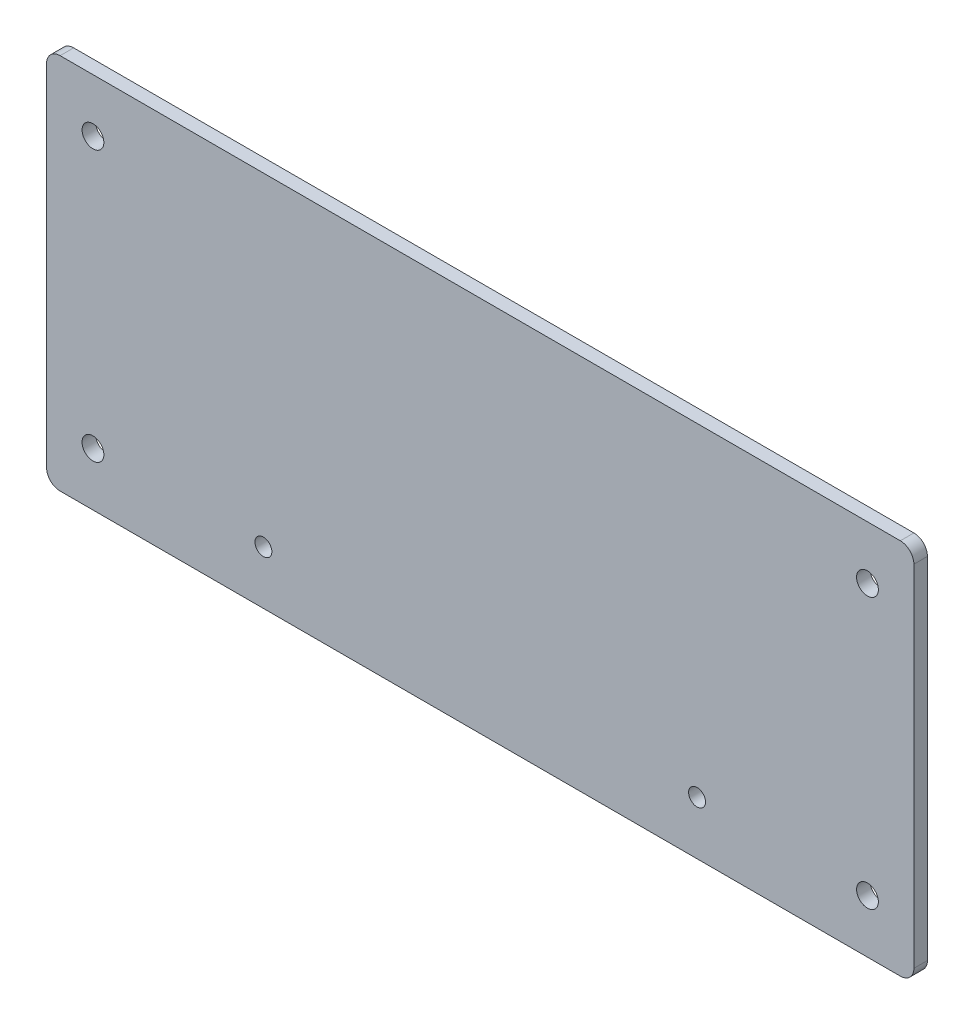
ISO-10303-21;
HEADER;
FILE_DESCRIPTION(('STEP AP214'),'2;1');
FILE_NAME('part.step','',(''),(''),'','','');
FILE_SCHEMA(('AUTOMOTIVE_DESIGN { 1 0 10303 214 1 1 1 1 }'));
ENDSEC;
DATA;
#1=APPLICATION_CONTEXT('core data for automotive mechanical design processes');
#2=APPLICATION_PROTOCOL_DEFINITION('international standard','automotive_design',2000,#1);
#3=PRODUCT_CONTEXT('',#1,'mechanical');
#4=PRODUCT('Part','Part','',(#3));
#5=PRODUCT_RELATED_PRODUCT_CATEGORY('part','',(#4));
#6=PRODUCT_DEFINITION_FORMATION('','',#4);
#7=PRODUCT_DEFINITION_CONTEXT('part definition',#1,'design');
#8=PRODUCT_DEFINITION('design','',#6,#7);
#9=PRODUCT_DEFINITION_SHAPE('','',#8);
#10=(LENGTH_UNIT() NAMED_UNIT(*) SI_UNIT(.MILLI.,.METRE.));
#11=(NAMED_UNIT(*) PLANE_ANGLE_UNIT() SI_UNIT($,.RADIAN.));
#12=(NAMED_UNIT(*) SI_UNIT($,.STERADIAN.) SOLID_ANGLE_UNIT());
#13=UNCERTAINTY_MEASURE_WITH_UNIT(LENGTH_MEASURE(1.E-05),#10,'distance_accuracy_value','');
#14=(GEOMETRIC_REPRESENTATION_CONTEXT(3) GLOBAL_UNCERTAINTY_ASSIGNED_CONTEXT((#13)) GLOBAL_UNIT_ASSIGNED_CONTEXT((#10,
#11,#12)) REPRESENTATION_CONTEXT('',''));
#15=CARTESIAN_POINT('',(0.,0.,0.));
#16=DIRECTION('',(0.,0.,1.));
#17=DIRECTION('',(1.,0.,0.));
#18=AXIS2_PLACEMENT_3D('',#15,#16,#17);
#19=CARTESIAN_POINT('',(-101.6,-44.1706,-3.175));
#20=DIRECTION('',(0.,0.,1.));
#21=DIRECTION('',(1.,0.,0.));
#22=AXIS2_PLACEMENT_3D('',#19,#20,#21);
#23=PLANE('',#22);
#24=CARTESIAN_POINT('',(-90.7288,-31.6738,-3.17500000000001));
#25=DIRECTION('',(0.,0.,-1.));
#26=DIRECTION('',(-1.,0.,0.));
#27=AXIS2_PLACEMENT_3D('',#24,#25,#26);
#28=CIRCLE('',#27,2.5527);
#29=CARTESIAN_POINT('',(-93.2815,-31.6738,-3.17500000000001));
#30=VERTEX_POINT('',#29);
#31=EDGE_CURVE('E145',#30,#30,#28,.F.);
#32=ORIENTED_EDGE('',*,*,#31,.T.);
#33=EDGE_LOOP('',(#32));
#34=FACE_BOUND('',#33,.T.);
#35=CARTESIAN_POINT('',(90.7288,-31.6738,-3.17500000000001));
#36=DIRECTION('',(0.,0.,-1.));
#37=DIRECTION('',(-1.,0.,0.));
#38=AXIS2_PLACEMENT_3D('',#35,#36,#37);
#39=CIRCLE('',#38,2.5527);
#40=CARTESIAN_POINT('',(88.1761,-31.6738,-3.17500000000001));
#41=VERTEX_POINT('',#40);
#42=EDGE_CURVE('E148',#41,#41,#39,.F.);
#43=ORIENTED_EDGE('',*,*,#42,.T.);
#44=EDGE_LOOP('',(#43));
#45=FACE_BOUND('',#44,.T.);
#46=CARTESIAN_POINT('',(90.7288,31.6738,-3.17500000000001));
#47=DIRECTION('',(0.,0.,-1.));
#48=DIRECTION('',(-1.,0.,0.));
#49=AXIS2_PLACEMENT_3D('',#46,#47,#48);
#50=CIRCLE('',#49,2.5527);
#51=CARTESIAN_POINT('',(88.1761,31.6738,-3.17500000000001));
#52=VERTEX_POINT('',#51);
#53=EDGE_CURVE('E151',#52,#52,#50,.F.);
#54=ORIENTED_EDGE('',*,*,#53,.T.);
#55=EDGE_LOOP('',(#54));
#56=FACE_BOUND('',#55,.T.);
#57=CARTESIAN_POINT('',(-90.7288,31.6738,-3.17500000000001));
#58=DIRECTION('',(0.,0.,-1.));
#59=DIRECTION('',(-1.,0.,0.));
#60=AXIS2_PLACEMENT_3D('',#57,#58,#59);
#61=CIRCLE('',#60,2.5527);
#62=CARTESIAN_POINT('',(-93.2815,31.6738,-3.17500000000001));
#63=VERTEX_POINT('',#62);
#64=EDGE_CURVE('E154',#63,#63,#61,.F.);
#65=ORIENTED_EDGE('',*,*,#64,.T.);
#66=EDGE_LOOP('',(#65));
#67=FACE_BOUND('',#66,.T.);
#68=CARTESIAN_POINT('',(-50.8,-31.6738,-3.17500000000001));
#69=DIRECTION('',(0.,0.,-1.));
#70=DIRECTION('',(-1.,0.,0.));
#71=AXIS2_PLACEMENT_3D('',#68,#69,#70);
#72=CIRCLE('',#71,1.9812);
#73=CARTESIAN_POINT('',(-52.7812,-31.6738,-3.17500000000001));
#74=VERTEX_POINT('',#73);
#75=EDGE_CURVE('E157',#74,#74,#72,.F.);
#76=ORIENTED_EDGE('',*,*,#75,.T.);
#77=EDGE_LOOP('',(#76));
#78=FACE_BOUND('',#77,.T.);
#79=CARTESIAN_POINT('',(50.8,-31.6738,-3.17500000000001));
#80=DIRECTION('',(0.,0.,-1.));
#81=DIRECTION('',(-1.,0.,0.));
#82=AXIS2_PLACEMENT_3D('',#79,#80,#81);
#83=CIRCLE('',#82,1.9812);
#84=CARTESIAN_POINT('',(48.8188,-31.6738,-3.17500000000001));
#85=VERTEX_POINT('',#84);
#86=EDGE_CURVE('E160',#85,#85,#83,.F.);
#87=ORIENTED_EDGE('',*,*,#86,.T.);
#88=EDGE_LOOP('',(#87));
#89=FACE_BOUND('',#88,.T.);
#90=CARTESIAN_POINT('',(98.425,-40.9956,-3.175));
#91=DIRECTION('',(0.,0.,-1.));
#92=DIRECTION('',(-1.,0.,0.));
#93=AXIS2_PLACEMENT_3D('',#90,#91,#92);
#94=CIRCLE('',#93,3.175);
#95=CARTESIAN_POINT('',(98.425,-44.1706,-3.175));
#96=VERTEX_POINT('',#95);
#97=CARTESIAN_POINT('',(101.6,-40.9956,-3.175));
#98=VERTEX_POINT('',#97);
#99=EDGE_CURVE('E20',#96,#98,#94,.F.);
#100=ORIENTED_EDGE('',*,*,#99,.F.);
#101=DIRECTION('',(1.,0.,0.));
#102=VECTOR('',#101,1.);
#103=CARTESIAN_POINT('',(-101.6,-44.1706,-3.175));
#104=LINE('',#103,#102);
#105=CARTESIAN_POINT('',(-98.425,-44.1706,-3.175));
#106=VERTEX_POINT('',#105);
#107=EDGE_CURVE('E89',#106,#96,#104,.T.);
#108=ORIENTED_EDGE('',*,*,#107,.F.);
#109=CARTESIAN_POINT('',(-98.425,-40.9956,-3.175));
#110=DIRECTION('',(0.,0.,-1.));
#111=DIRECTION('',(-1.,0.,0.));
#112=AXIS2_PLACEMENT_3D('',#109,#110,#111);
#113=CIRCLE('',#112,3.175);
#114=CARTESIAN_POINT('',(-101.6,-40.9956,-3.175));
#115=VERTEX_POINT('',#114);
#116=EDGE_CURVE('E109',#115,#106,#113,.F.);
#117=ORIENTED_EDGE('',*,*,#116,.F.);
#118=DIRECTION('',(0.,-1.,0.));
#119=VECTOR('',#118,1.);
#120=CARTESIAN_POINT('',(-101.6,44.1706,-3.175));
#121=LINE('',#120,#119);
#122=CARTESIAN_POINT('',(-101.6,40.9956,-3.175));
#123=VERTEX_POINT('',#122);
#124=EDGE_CURVE('E107',#123,#115,#121,.T.);
#125=ORIENTED_EDGE('',*,*,#124,.F.);
#126=CARTESIAN_POINT('',(-98.425,40.9956,-3.175));
#127=DIRECTION('',(0.,0.,-1.));
#128=DIRECTION('',(-1.,0.,0.));
#129=AXIS2_PLACEMENT_3D('',#126,#127,#128);
#130=CIRCLE('',#129,3.175);
#131=CARTESIAN_POINT('',(-98.425,44.1706,-3.175));
#132=VERTEX_POINT('',#131);
#133=EDGE_CURVE('E114',#132,#123,#130,.F.);
#134=ORIENTED_EDGE('',*,*,#133,.F.);
#135=DIRECTION('',(1.,0.,0.));
#136=VECTOR('',#135,1.);
#137=CARTESIAN_POINT('',(101.6,44.1706,-3.175));
#138=LINE('',#137,#136);
#139=CARTESIAN_POINT('',(98.425,44.1706,-3.175));
#140=VERTEX_POINT('',#139);
#141=EDGE_CURVE('E112',#140,#132,#138,.F.);
#142=ORIENTED_EDGE('',*,*,#141,.F.);
#143=CARTESIAN_POINT('',(98.425,40.9956,-3.175));
#144=DIRECTION('',(0.,0.,-1.));
#145=DIRECTION('',(-1.,0.,0.));
#146=AXIS2_PLACEMENT_3D('',#143,#144,#145);
#147=CIRCLE('',#146,3.175);
#148=CARTESIAN_POINT('',(101.6,40.9956,-3.175));
#149=VERTEX_POINT('',#148);
#150=EDGE_CURVE('E93',#149,#140,#147,.F.);
#151=ORIENTED_EDGE('',*,*,#150,.F.);
#152=DIRECTION('',(0.,1.,0.));
#153=VECTOR('',#152,1.);
#154=CARTESIAN_POINT('',(101.6,-44.1706,-3.175));
#155=LINE('',#154,#153);
#156=EDGE_CURVE('E91',#98,#149,#155,.T.);
#157=ORIENTED_EDGE('',*,*,#156,.F.);
#158=EDGE_LOOP('',(#100,#108,#117,#125,#134,#142,#151,#157));
#159=FACE_BOUND('',#158,.T.);
#160=ADVANCED_FACE('F17',(#34,#45,#56,#67,#78,#89,#159),#23,.F.);
#161=CARTESIAN_POINT('',(-101.6,-44.1706,-3.175));
#162=DIRECTION('',(0.,-1.,0.));
#163=DIRECTION('',(0.,0.,-1.));
#164=AXIS2_PLACEMENT_3D('',#161,#162,#163);
#165=PLANE('',#164);
#166=DIRECTION('',(1.,0.,0.));
#167=VECTOR('',#166,1.);
#168=CARTESIAN_POINT('',(-101.6,-44.1706,0.));
#169=LINE('',#168,#167);
#170=CARTESIAN_POINT('',(-98.425,-44.1706,0.));
#171=VERTEX_POINT('',#170);
#172=CARTESIAN_POINT('',(98.425,-44.1706,0.));
#173=VERTEX_POINT('',#172);
#174=EDGE_CURVE('E144',#171,#173,#169,.T.);
#175=ORIENTED_EDGE('',*,*,#174,.F.);
#176=DIRECTION('',(0.,0.,-1.));
#177=VECTOR('',#176,1.);
#178=CARTESIAN_POINT('',(-98.425,-44.1706,-3.175));
#179=LINE('',#178,#177);
#180=EDGE_CURVE('E165',#106,#171,#179,.F.);
#181=ORIENTED_EDGE('',*,*,#180,.F.);
#182=ORIENTED_EDGE('',*,*,#107,.T.);
#183=DIRECTION('',(0.,0.,-1.));
#184=VECTOR('',#183,1.);
#185=CARTESIAN_POINT('',(98.425,-44.1706,-3.175));
#186=LINE('',#185,#184);
#187=EDGE_CURVE('E88',#173,#96,#186,.T.);
#188=ORIENTED_EDGE('',*,*,#187,.F.);
#189=EDGE_LOOP('',(#175,#181,#182,#188));
#190=FACE_BOUND('',#189,.T.);
#191=ADVANCED_FACE('F197',(#190),#165,.T.);
#192=CARTESIAN_POINT('',(98.425,-40.9956,-3.175));
#193=DIRECTION('',(0.,0.,-1.));
#194=DIRECTION('',(-1.,0.,0.));
#195=AXIS2_PLACEMENT_3D('',#192,#193,#194);
#196=CYLINDRICAL_SURFACE('',#195,3.175);
#197=CARTESIAN_POINT('',(98.425,-40.9956,0.));
#198=DIRECTION('',(0.,0.,-1.));
#199=DIRECTION('',(-1.,0.,0.));
#200=AXIS2_PLACEMENT_3D('',#197,#198,#199);
#201=CIRCLE('',#200,3.175);
#202=CARTESIAN_POINT('',(101.6,-40.9956,0.));
#203=VERTEX_POINT('',#202);
#204=EDGE_CURVE('E142',#173,#203,#201,.F.);
#205=ORIENTED_EDGE('',*,*,#204,.F.);
#206=ORIENTED_EDGE('',*,*,#187,.T.);
#207=ORIENTED_EDGE('',*,*,#99,.T.);
#208=DIRECTION('',(0.,0.,-1.));
#209=VECTOR('',#208,1.);
#210=CARTESIAN_POINT('',(101.6,-40.9956,-3.175));
#211=LINE('',#210,#209);
#212=EDGE_CURVE('E86',#203,#98,#211,.T.);
#213=ORIENTED_EDGE('',*,*,#212,.F.);
#214=EDGE_LOOP('',(#205,#206,#207,#213));
#215=FACE_BOUND('',#214,.T.);
#216=ADVANCED_FACE('F84',(#215),#196,.T.);
#217=CARTESIAN_POINT('',(101.6,-44.1706,-3.175));
#218=DIRECTION('',(1.,0.,0.));
#219=DIRECTION('',(0.,0.,-1.));
#220=AXIS2_PLACEMENT_3D('',#217,#218,#219);
#221=PLANE('',#220);
#222=ORIENTED_EDGE('',*,*,#156,.T.);
#223=DIRECTION('',(0.,0.,-1.));
#224=VECTOR('',#223,1.);
#225=CARTESIAN_POINT('',(101.6,40.9956,-3.175));
#226=LINE('',#225,#224);
#227=CARTESIAN_POINT('',(101.6,40.9956,0.));
#228=VERTEX_POINT('',#227);
#229=EDGE_CURVE('E104',#228,#149,#226,.T.);
#230=ORIENTED_EDGE('',*,*,#229,.F.);
#231=DIRECTION('',(0.,1.,0.));
#232=VECTOR('',#231,1.);
#233=CARTESIAN_POINT('',(101.6,-44.1706,0.));
#234=LINE('',#233,#232);
#235=EDGE_CURVE('E99',#203,#228,#234,.T.);
#236=ORIENTED_EDGE('',*,*,#235,.F.);
#237=ORIENTED_EDGE('',*,*,#212,.T.);
#238=EDGE_LOOP('',(#222,#230,#236,#237));
#239=FACE_BOUND('',#238,.T.);
#240=ADVANCED_FACE('F97',(#239),#221,.T.);
#241=CARTESIAN_POINT('',(98.425,40.9956,-3.175));
#242=DIRECTION('',(0.,0.,-1.));
#243=DIRECTION('',(-1.,0.,0.));
#244=AXIS2_PLACEMENT_3D('',#241,#242,#243);
#245=CYLINDRICAL_SURFACE('',#244,3.175);
#246=CARTESIAN_POINT('',(98.425,40.9956,0.));
#247=DIRECTION('',(0.,0.,-1.));
#248=DIRECTION('',(-1.,0.,0.));
#249=AXIS2_PLACEMENT_3D('',#246,#247,#248);
#250=CIRCLE('',#249,3.175);
#251=CARTESIAN_POINT('',(98.425,44.1706,0.));
#252=VERTEX_POINT('',#251);
#253=EDGE_CURVE('E139',#228,#252,#250,.F.);
#254=ORIENTED_EDGE('',*,*,#253,.F.);
#255=ORIENTED_EDGE('',*,*,#229,.T.);
#256=ORIENTED_EDGE('',*,*,#150,.T.);
#257=DIRECTION('',(0.,0.,1.));
#258=VECTOR('',#257,1.);
#259=CARTESIAN_POINT('',(98.425,44.1706,-3.175));
#260=LINE('',#259,#258);
#261=EDGE_CURVE('E115',#252,#140,#260,.F.);
#262=ORIENTED_EDGE('',*,*,#261,.F.);
#263=EDGE_LOOP('',(#254,#255,#256,#262));
#264=FACE_BOUND('',#263,.T.);
#265=ADVANCED_FACE('F198',(#264),#245,.T.);
#266=CARTESIAN_POINT('',(101.6,44.1706,-3.175));
#267=DIRECTION('',(0.,1.,0.));
#268=DIRECTION('',(0.,0.,1.));
#269=AXIS2_PLACEMENT_3D('',#266,#267,#268);
#270=PLANE('',#269);
#271=ORIENTED_EDGE('',*,*,#141,.T.);
#272=DIRECTION('',(0.,0.,-1.));
#273=VECTOR('',#272,1.);
#274=CARTESIAN_POINT('',(-98.425,44.1706,-3.175));
#275=LINE('',#274,#273);
#276=CARTESIAN_POINT('',(-98.425,44.1706,0.));
#277=VERTEX_POINT('',#276);
#278=EDGE_CURVE('E166',#277,#132,#275,.T.);
#279=ORIENTED_EDGE('',*,*,#278,.F.);
#280=DIRECTION('',(1.,0.,0.));
#281=VECTOR('',#280,1.);
#282=CARTESIAN_POINT('',(-101.6,44.1706,0.));
#283=LINE('',#282,#281);
#284=EDGE_CURVE('E138',#252,#277,#283,.F.);
#285=ORIENTED_EDGE('',*,*,#284,.F.);
#286=ORIENTED_EDGE('',*,*,#261,.T.);
#287=EDGE_LOOP('',(#271,#279,#285,#286));
#288=FACE_BOUND('',#287,.T.);
#289=ADVANCED_FACE('F199',(#288),#270,.T.);
#290=CARTESIAN_POINT('',(-98.425,40.9956,-3.175));
#291=DIRECTION('',(0.,0.,-1.));
#292=DIRECTION('',(-1.,0.,0.));
#293=AXIS2_PLACEMENT_3D('',#290,#291,#292);
#294=CYLINDRICAL_SURFACE('',#293,3.175);
#295=CARTESIAN_POINT('',(-98.425,40.9956,0.));
#296=DIRECTION('',(0.,0.,-1.));
#297=DIRECTION('',(-1.,0.,0.));
#298=AXIS2_PLACEMENT_3D('',#295,#296,#297);
#299=CIRCLE('',#298,3.175);
#300=CARTESIAN_POINT('',(-101.6,40.9956,0.));
#301=VERTEX_POINT('',#300);
#302=EDGE_CURVE('E135',#277,#301,#299,.F.);
#303=ORIENTED_EDGE('',*,*,#302,.F.);
#304=ORIENTED_EDGE('',*,*,#278,.T.);
#305=ORIENTED_EDGE('',*,*,#133,.T.);
#306=DIRECTION('',(0.,0.,1.));
#307=VECTOR('',#306,1.);
#308=CARTESIAN_POINT('',(-101.6,40.9956,-3.175));
#309=LINE('',#308,#307);
#310=EDGE_CURVE('E110',#301,#123,#309,.F.);
#311=ORIENTED_EDGE('',*,*,#310,.F.);
#312=EDGE_LOOP('',(#303,#304,#305,#311));
#313=FACE_BOUND('',#312,.T.);
#314=ADVANCED_FACE('F192',(#313),#294,.T.);
#315=CARTESIAN_POINT('',(-101.6,44.1706,-3.175));
#316=DIRECTION('',(-1.,0.,0.));
#317=DIRECTION('',(0.,-1.,0.));
#318=AXIS2_PLACEMENT_3D('',#315,#316,#317);
#319=PLANE('',#318);
#320=ORIENTED_EDGE('',*,*,#124,.T.);
#321=DIRECTION('',(0.,0.,-1.));
#322=VECTOR('',#321,1.);
#323=CARTESIAN_POINT('',(-101.6,-40.9956,-3.175));
#324=LINE('',#323,#322);
#325=CARTESIAN_POINT('',(-101.6,-40.9956,0.));
#326=VERTEX_POINT('',#325);
#327=EDGE_CURVE('E35',#326,#115,#324,.T.);
#328=ORIENTED_EDGE('',*,*,#327,.F.);
#329=DIRECTION('',(0.,1.,0.));
#330=VECTOR('',#329,1.);
#331=CARTESIAN_POINT('',(-101.6,-44.1706,0.));
#332=LINE('',#331,#330);
#333=EDGE_CURVE('E134',#301,#326,#332,.F.);
#334=ORIENTED_EDGE('',*,*,#333,.F.);
#335=ORIENTED_EDGE('',*,*,#310,.T.);
#336=EDGE_LOOP('',(#320,#328,#334,#335));
#337=FACE_BOUND('',#336,.T.);
#338=ADVANCED_FACE('F189',(#337),#319,.T.);
#339=CARTESIAN_POINT('',(-98.425,-40.9956,-3.175));
#340=DIRECTION('',(0.,0.,-1.));
#341=DIRECTION('',(-1.,0.,0.));
#342=AXIS2_PLACEMENT_3D('',#339,#340,#341);
#343=CYLINDRICAL_SURFACE('',#342,3.175);
#344=CARTESIAN_POINT('',(-98.425,-40.9956,0.));
#345=DIRECTION('',(0.,0.,-1.));
#346=DIRECTION('',(-1.,0.,0.));
#347=AXIS2_PLACEMENT_3D('',#344,#345,#346);
#348=CIRCLE('',#347,3.175);
#349=EDGE_CURVE('E131',#326,#171,#348,.F.);
#350=ORIENTED_EDGE('',*,*,#349,.F.);
#351=ORIENTED_EDGE('',*,*,#327,.T.);
#352=ORIENTED_EDGE('',*,*,#116,.T.);
#353=ORIENTED_EDGE('',*,*,#180,.T.);
#354=EDGE_LOOP('',(#350,#351,#352,#353));
#355=FACE_BOUND('',#354,.T.);
#356=ADVANCED_FACE('F195',(#355),#343,.T.);
#357=CARTESIAN_POINT('',(50.8,-31.6738,-221.595325407465));
#358=DIRECTION('',(0.,0.,-1.));
#359=DIRECTION('',(-1.,0.,0.));
#360=AXIS2_PLACEMENT_3D('',#357,#358,#359);
#361=CYLINDRICAL_SURFACE('',#360,1.9812);
#362=CARTESIAN_POINT('',(50.8,-31.6738,0.));
#363=DIRECTION('',(0.,0.,-1.));
#364=DIRECTION('',(-1.,0.,0.));
#365=AXIS2_PLACEMENT_3D('',#362,#363,#364);
#366=CIRCLE('',#365,1.9812);
#367=CARTESIAN_POINT('',(48.8188,-31.6738,0.));
#368=VERTEX_POINT('',#367);
#369=EDGE_CURVE('E128',#368,#368,#366,.T.);
#370=ORIENTED_EDGE('',*,*,#369,.F.);
#371=EDGE_LOOP('',(#370));
#372=FACE_BOUND('',#371,.T.);
#373=ORIENTED_EDGE('',*,*,#86,.F.);
#374=EDGE_LOOP('',(#373));
#375=FACE_BOUND('',#374,.T.);
#376=ADVANCED_FACE('F235',(#372,#375),#361,.F.);
#377=CARTESIAN_POINT('',(-50.8,-31.6738,-221.595325407465));
#378=DIRECTION('',(0.,0.,-1.));
#379=DIRECTION('',(-1.,0.,0.));
#380=AXIS2_PLACEMENT_3D('',#377,#378,#379);
#381=CYLINDRICAL_SURFACE('',#380,1.9812);
#382=CARTESIAN_POINT('',(-50.8,-31.6738,0.));
#383=DIRECTION('',(0.,0.,-1.));
#384=DIRECTION('',(-1.,0.,0.));
#385=AXIS2_PLACEMENT_3D('',#382,#383,#384);
#386=CIRCLE('',#385,1.9812);
#387=CARTESIAN_POINT('',(-52.7812,-31.6738,0.));
#388=VERTEX_POINT('',#387);
#389=EDGE_CURVE('E125',#388,#388,#386,.T.);
#390=ORIENTED_EDGE('',*,*,#389,.F.);
#391=EDGE_LOOP('',(#390));
#392=FACE_BOUND('',#391,.T.);
#393=ORIENTED_EDGE('',*,*,#75,.F.);
#394=EDGE_LOOP('',(#393));
#395=FACE_BOUND('',#394,.T.);
#396=ADVANCED_FACE('F231',(#392,#395),#381,.F.);
#397=CARTESIAN_POINT('',(-90.7288,31.6738,-221.595325407465));
#398=DIRECTION('',(0.,0.,-1.));
#399=DIRECTION('',(-1.,0.,0.));
#400=AXIS2_PLACEMENT_3D('',#397,#398,#399);
#401=CYLINDRICAL_SURFACE('',#400,2.5527);
#402=CARTESIAN_POINT('',(-90.7288,31.6738,0.));
#403=DIRECTION('',(0.,0.,-1.));
#404=DIRECTION('',(-1.,0.,0.));
#405=AXIS2_PLACEMENT_3D('',#402,#403,#404);
#406=CIRCLE('',#405,2.5527);
#407=CARTESIAN_POINT('',(-93.2815,31.6738,0.));
#408=VERTEX_POINT('',#407);
#409=EDGE_CURVE('E122',#408,#408,#406,.T.);
#410=ORIENTED_EDGE('',*,*,#409,.F.);
#411=EDGE_LOOP('',(#410));
#412=FACE_BOUND('',#411,.T.);
#413=ORIENTED_EDGE('',*,*,#64,.F.);
#414=EDGE_LOOP('',(#413));
#415=FACE_BOUND('',#414,.T.);
#416=ADVANCED_FACE('F227',(#412,#415),#401,.F.);
#417=CARTESIAN_POINT('',(90.7288,31.6738,-221.595325407465));
#418=DIRECTION('',(0.,0.,-1.));
#419=DIRECTION('',(-1.,0.,0.));
#420=AXIS2_PLACEMENT_3D('',#417,#418,#419);
#421=CYLINDRICAL_SURFACE('',#420,2.5527);
#422=CARTESIAN_POINT('',(90.7288,31.6738,0.));
#423=DIRECTION('',(0.,0.,-1.));
#424=DIRECTION('',(-1.,0.,0.));
#425=AXIS2_PLACEMENT_3D('',#422,#423,#424);
#426=CIRCLE('',#425,2.5527);
#427=CARTESIAN_POINT('',(88.1761,31.6738,0.));
#428=VERTEX_POINT('',#427);
#429=EDGE_CURVE('E119',#428,#428,#426,.T.);
#430=ORIENTED_EDGE('',*,*,#429,.F.);
#431=EDGE_LOOP('',(#430));
#432=FACE_BOUND('',#431,.T.);
#433=ORIENTED_EDGE('',*,*,#53,.F.);
#434=EDGE_LOOP('',(#433));
#435=FACE_BOUND('',#434,.T.);
#436=ADVANCED_FACE('F223',(#432,#435),#421,.F.);
#437=CARTESIAN_POINT('',(90.7288,-31.6738,-221.595325407465));
#438=DIRECTION('',(0.,0.,-1.));
#439=DIRECTION('',(-1.,0.,0.));
#440=AXIS2_PLACEMENT_3D('',#437,#438,#439);
#441=CYLINDRICAL_SURFACE('',#440,2.5527);
#442=CARTESIAN_POINT('',(90.7288,-31.6738,0.));
#443=DIRECTION('',(0.,0.,-1.));
#444=DIRECTION('',(-1.,0.,0.));
#445=AXIS2_PLACEMENT_3D('',#442,#443,#444);
#446=CIRCLE('',#445,2.5527);
#447=CARTESIAN_POINT('',(88.1761,-31.6738,0.));
#448=VERTEX_POINT('',#447);
#449=EDGE_CURVE('E26',#448,#448,#446,.T.);
#450=ORIENTED_EDGE('',*,*,#449,.F.);
#451=EDGE_LOOP('',(#450));
#452=FACE_BOUND('',#451,.T.);
#453=ORIENTED_EDGE('',*,*,#42,.F.);
#454=EDGE_LOOP('',(#453));
#455=FACE_BOUND('',#454,.T.);
#456=ADVANCED_FACE('F216',(#452,#455),#441,.F.);
#457=CARTESIAN_POINT('',(-90.7288,-31.6738,-221.595325407465));
#458=DIRECTION('',(0.,0.,-1.));
#459=DIRECTION('',(-1.,0.,0.));
#460=AXIS2_PLACEMENT_3D('',#457,#458,#459);
#461=CYLINDRICAL_SURFACE('',#460,2.5527);
#462=CARTESIAN_POINT('',(-90.7288,-31.6738,0.));
#463=DIRECTION('',(0.,0.,-1.));
#464=DIRECTION('',(-1.,0.,0.));
#465=AXIS2_PLACEMENT_3D('',#462,#463,#464);
#466=CIRCLE('',#465,2.5527);
#467=CARTESIAN_POINT('',(-93.2815,-31.6738,0.));
#468=VERTEX_POINT('',#467);
#469=EDGE_CURVE('E11',#468,#468,#466,.T.);
#470=ORIENTED_EDGE('',*,*,#469,.F.);
#471=EDGE_LOOP('',(#470));
#472=FACE_BOUND('',#471,.T.);
#473=ORIENTED_EDGE('',*,*,#31,.F.);
#474=EDGE_LOOP('',(#473));
#475=FACE_BOUND('',#474,.T.);
#476=ADVANCED_FACE('F210',(#472,#475),#461,.F.);
#477=CARTESIAN_POINT('',(-101.6,-44.1706,0.));
#478=DIRECTION('',(0.,0.,1.));
#479=DIRECTION('',(1.,0.,0.));
#480=AXIS2_PLACEMENT_3D('',#477,#478,#479);
#481=PLANE('',#480);
#482=ORIENTED_EDGE('',*,*,#469,.T.);
#483=EDGE_LOOP('',(#482));
#484=FACE_BOUND('',#483,.T.);
#485=ORIENTED_EDGE('',*,*,#449,.T.);
#486=EDGE_LOOP('',(#485));
#487=FACE_BOUND('',#486,.T.);
#488=ORIENTED_EDGE('',*,*,#429,.T.);
#489=EDGE_LOOP('',(#488));
#490=FACE_BOUND('',#489,.T.);
#491=ORIENTED_EDGE('',*,*,#409,.T.);
#492=EDGE_LOOP('',(#491));
#493=FACE_BOUND('',#492,.T.);
#494=ORIENTED_EDGE('',*,*,#389,.T.);
#495=EDGE_LOOP('',(#494));
#496=FACE_BOUND('',#495,.T.);
#497=ORIENTED_EDGE('',*,*,#369,.T.);
#498=EDGE_LOOP('',(#497));
#499=FACE_BOUND('',#498,.T.);
#500=ORIENTED_EDGE('',*,*,#333,.T.);
#501=ORIENTED_EDGE('',*,*,#349,.T.);
#502=ORIENTED_EDGE('',*,*,#174,.T.);
#503=ORIENTED_EDGE('',*,*,#204,.T.);
#504=ORIENTED_EDGE('',*,*,#235,.T.);
#505=ORIENTED_EDGE('',*,*,#253,.T.);
#506=ORIENTED_EDGE('',*,*,#284,.T.);
#507=ORIENTED_EDGE('',*,*,#302,.T.);
#508=EDGE_LOOP('',(#500,#501,#502,#503,#504,#505,#506,#507));
#509=FACE_BOUND('',#508,.T.);
#510=ADVANCED_FACE('F187',(#484,#487,#490,#493,#496,#499,#509),#481,.T.);
#511=CLOSED_SHELL('',(#160,#191,#216,#240,#265,#289,#314,#338,#356,#376,#396,#416,#436,#456,
#476,#510));
#512=MANIFOLD_SOLID_BREP('B1',#511);
#513=ADVANCED_BREP_SHAPE_REPRESENTATION('',(#18,#512),#14);
#514=SHAPE_DEFINITION_REPRESENTATION(#9,#513);
ENDSEC;
END-ISO-10303-21;
